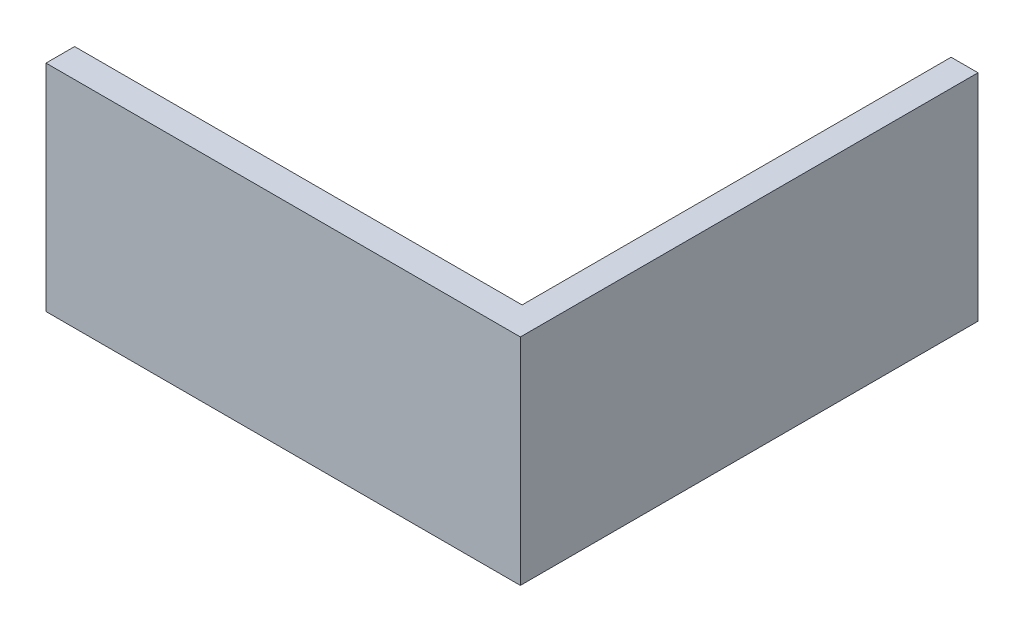
ISO-10303-21;
HEADER;
FILE_DESCRIPTION(('STEP AP214'),'2;1');
FILE_NAME('part.step','',(''),(''),'','','');
FILE_SCHEMA(('AUTOMOTIVE_DESIGN { 1 0 10303 214 1 1 1 1 }'));
ENDSEC;
DATA;
#1=APPLICATION_CONTEXT('core data for automotive mechanical design processes');
#2=APPLICATION_PROTOCOL_DEFINITION('international standard','automotive_design',2000,#1);
#3=PRODUCT_CONTEXT('',#1,'mechanical');
#4=PRODUCT('Part','Part','',(#3));
#5=PRODUCT_RELATED_PRODUCT_CATEGORY('part','',(#4));
#6=PRODUCT_DEFINITION_FORMATION('','',#4);
#7=PRODUCT_DEFINITION_CONTEXT('part definition',#1,'design');
#8=PRODUCT_DEFINITION('design','',#6,#7);
#9=PRODUCT_DEFINITION_SHAPE('','',#8);
#10=(LENGTH_UNIT() NAMED_UNIT(*) SI_UNIT(.MILLI.,.METRE.));
#11=(NAMED_UNIT(*) PLANE_ANGLE_UNIT() SI_UNIT($,.RADIAN.));
#12=(NAMED_UNIT(*) SI_UNIT($,.STERADIAN.) SOLID_ANGLE_UNIT());
#13=UNCERTAINTY_MEASURE_WITH_UNIT(LENGTH_MEASURE(1.E-05),#10,'distance_accuracy_value','');
#14=(GEOMETRIC_REPRESENTATION_CONTEXT(3) GLOBAL_UNCERTAINTY_ASSIGNED_CONTEXT((#13)) GLOBAL_UNIT_ASSIGNED_CONTEXT((#10,
#11,#12)) REPRESENTATION_CONTEXT('',''));
#15=CARTESIAN_POINT('',(0.,0.,0.));
#16=DIRECTION('',(0.,0.,1.));
#17=DIRECTION('',(1.,0.,0.));
#18=AXIS2_PLACEMENT_3D('',#15,#16,#17);
#19=CARTESIAN_POINT('',(-16.4694269363755,0.,-30.));
#20=DIRECTION('',(0.,0.,1.));
#21=DIRECTION('',(1.,0.,0.));
#22=AXIS2_PLACEMENT_3D('',#19,#20,#21);
#23=CYLINDRICAL_SURFACE('',#22,5.);
#24=CARTESIAN_POINT('',(-16.4694269363755,0.,-30.));
#25=DIRECTION('',(0.,0.,1.));
#26=DIRECTION('',(1.,0.,0.));
#27=AXIS2_PLACEMENT_3D('',#24,#25,#26);
#28=CIRCLE('',#27,5.);
#29=CARTESIAN_POINT('',(-11.4694269363755,0.,-30.));
#30=VERTEX_POINT('',#29);
#31=EDGE_CURVE('E11',#30,#30,#28,.T.);
#32=ORIENTED_EDGE('',*,*,#31,.T.);
#33=EDGE_LOOP('',(#32));
#34=FACE_BOUND('',#33,.T.);
#35=CARTESIAN_POINT('',(-16.4694269363755,0.,0.));
#36=DIRECTION('',(0.,0.,1.));
#37=DIRECTION('',(1.,0.,0.));
#38=AXIS2_PLACEMENT_3D('',#35,#36,#37);
#39=CIRCLE('',#38,5.);
#40=CARTESIAN_POINT('',(-11.4694269363755,0.,0.));
#41=VERTEX_POINT('',#40);
#42=EDGE_CURVE('E46',#41,#41,#39,.T.);
#43=ORIENTED_EDGE('',*,*,#42,.F.);
#44=EDGE_LOOP('',(#43));
#45=FACE_BOUND('',#44,.T.);
#46=ADVANCED_FACE('F43',(#34,#45),#23,.T.);
#47=CARTESIAN_POINT('',(-16.4694269363755,0.,-30.));
#48=DIRECTION('',(0.,0.,1.));
#49=DIRECTION('',(1.,0.,0.));
#50=AXIS2_PLACEMENT_3D('',#47,#48,#49);
#51=PLANE('',#50);
#52=ORIENTED_EDGE('',*,*,#31,.F.);
#53=EDGE_LOOP('',(#52));
#54=FACE_BOUND('',#53,.T.);
#55=ADVANCED_FACE('F58',(#54),#51,.F.);
#56=CARTESIAN_POINT('',(-16.4694269363755,0.,0.));
#57=DIRECTION('',(0.,0.,1.));
#58=DIRECTION('',(1.,0.,0.));
#59=AXIS2_PLACEMENT_3D('',#56,#57,#58);
#60=PLANE('',#59);
#61=ORIENTED_EDGE('',*,*,#42,.T.);
#62=EDGE_LOOP('',(#61));
#63=FACE_BOUND('',#62,.T.);
#64=ADVANCED_FACE('F55',(#63),#60,.T.);
#65=CLOSED_SHELL('',(#46,#55,#64));
#66=MANIFOLD_SOLID_BREP('B2',#65);
#67=CARTESIAN_POINT('',(82.9294362672978,37.621523407919,10.));
#68=DIRECTION('',(-1.,0.,0.));
#69=DIRECTION('',(0.,0.,1.));
#70=AXIS2_PLACEMENT_3D('',#67,#68,#69);
#71=PLANE('',#70);
#72=DIRECTION('',(0.,0.,-1.));
#73=VECTOR('',#72,1.);
#74=CARTESIAN_POINT('',(82.9294362672978,-37.621523407919,10.));
#75=LINE('',#74,#73);
#76=CARTESIAN_POINT('',(82.9294362672978,-37.621523407919,10.));
#77=VERTEX_POINT('',#76);
#78=CARTESIAN_POINT('',(82.9294362672978,-37.621523407919,-150.));
#79=VERTEX_POINT('',#78);
#80=EDGE_CURVE('E183',#77,#79,#75,.T.);
#81=ORIENTED_EDGE('',*,*,#80,.T.);
#82=DIRECTION('',(0.,1.,0.));
#83=VECTOR('',#82,1.);
#84=CARTESIAN_POINT('',(82.9294362672978,37.621523407919,-150.));
#85=LINE('',#84,#83);
#86=CARTESIAN_POINT('',(82.9294362672978,37.621523407919,-150.));
#87=VERTEX_POINT('',#86);
#88=EDGE_CURVE('E162',#79,#87,#85,.T.);
#89=ORIENTED_EDGE('',*,*,#88,.T.);
#90=DIRECTION('',(0.,0.,-1.));
#91=VECTOR('',#90,1.);
#92=CARTESIAN_POINT('',(82.9294362672978,37.621523407919,10.));
#93=LINE('',#92,#91);
#94=CARTESIAN_POINT('',(82.9294362672978,37.621523407919,10.));
#95=VERTEX_POINT('',#94);
#96=EDGE_CURVE('E41',#95,#87,#93,.T.);
#97=ORIENTED_EDGE('',*,*,#96,.F.);
#98=DIRECTION('',(0.,1.,0.));
#99=VECTOR('',#98,1.);
#100=CARTESIAN_POINT('',(82.9294362672978,37.621523407919,10.));
#101=LINE('',#100,#99);
#102=EDGE_CURVE('E177',#77,#95,#101,.T.);
#103=ORIENTED_EDGE('',*,*,#102,.F.);
#104=EDGE_LOOP('',(#81,#89,#97,#103));
#105=FACE_BOUND('',#104,.T.);
#106=ADVANCED_FACE('F84',(#105),#71,.F.);
#107=CARTESIAN_POINT('',(-82.9294362672978,37.621523407919,10.));
#108=DIRECTION('',(0.,-1.,0.));
#109=DIRECTION('',(0.,0.,-1.));
#110=AXIS2_PLACEMENT_3D('',#107,#108,#109);
#111=PLANE('',#110);
#112=ORIENTED_EDGE('',*,*,#96,.T.);
#113=DIRECTION('',(-1.,0.,0.));
#114=VECTOR('',#113,1.);
#115=CARTESIAN_POINT('',(73.5305730636245,37.621523407919,-150.));
#116=LINE('',#115,#114);
#117=CARTESIAN_POINT('',(73.5305730636245,37.621523407919,-150.));
#118=VERTEX_POINT('',#117);
#119=EDGE_CURVE('E152',#87,#118,#116,.T.);
#120=ORIENTED_EDGE('',*,*,#119,.T.);
#121=DIRECTION('',(0.,0.,1.));
#122=VECTOR('',#121,1.);
#123=CARTESIAN_POINT('',(73.5305730636245,37.621523407919,-150.));
#124=LINE('',#123,#122);
#125=CARTESIAN_POINT('',(73.5305730636245,37.621523407919,0.));
#126=VERTEX_POINT('',#125);
#127=EDGE_CURVE('E151',#118,#126,#124,.T.);
#128=ORIENTED_EDGE('',*,*,#127,.T.);
#129=DIRECTION('',(-1.,0.,0.));
#130=VECTOR('',#129,1.);
#131=CARTESIAN_POINT('',(-82.9294362672978,37.621523407919,0.));
#132=LINE('',#131,#130);
#133=CARTESIAN_POINT('',(-82.9294362672978,37.621523407919,0.));
#134=VERTEX_POINT('',#133);
#135=EDGE_CURVE('E175',#126,#134,#132,.T.);
#136=ORIENTED_EDGE('',*,*,#135,.T.);
#137=DIRECTION('',(0.,0.,-1.));
#138=VECTOR('',#137,1.);
#139=CARTESIAN_POINT('',(-82.9294362672978,37.621523407919,10.));
#140=LINE('',#139,#138);
#141=CARTESIAN_POINT('',(-82.9294362672978,37.621523407919,10.));
#142=VERTEX_POINT('',#141);
#143=EDGE_CURVE('E91',#142,#134,#140,.T.);
#144=ORIENTED_EDGE('',*,*,#143,.F.);
#145=DIRECTION('',(-1.,0.,0.));
#146=VECTOR('',#145,1.);
#147=CARTESIAN_POINT('',(-82.9294362672978,37.621523407919,10.));
#148=LINE('',#147,#146);
#149=EDGE_CURVE('E130',#95,#142,#148,.T.);
#150=ORIENTED_EDGE('',*,*,#149,.F.);
#151=EDGE_LOOP('',(#112,#120,#128,#136,#144,#150));
#152=FACE_BOUND('',#151,.T.);
#153=ADVANCED_FACE('F194',(#152),#111,.F.);
#154=CARTESIAN_POINT('',(-82.9294362672978,37.621523407919,10.));
#155=DIRECTION('',(1.,0.,0.));
#156=DIRECTION('',(0.,0.,-1.));
#157=AXIS2_PLACEMENT_3D('',#154,#155,#156);
#158=PLANE('',#157);
#159=DIRECTION('',(0.,-1.,0.));
#160=VECTOR('',#159,1.);
#161=CARTESIAN_POINT('',(-82.9294362672978,37.621523407919,0.));
#162=LINE('',#161,#160);
#163=CARTESIAN_POINT('',(-82.9294362672978,-37.621523407919,0.));
#164=VERTEX_POINT('',#163);
#165=EDGE_CURVE('E123',#134,#164,#162,.T.);
#166=ORIENTED_EDGE('',*,*,#165,.T.);
#167=DIRECTION('',(0.,0.,-1.));
#168=VECTOR('',#167,1.);
#169=CARTESIAN_POINT('',(-82.9294362672978,-37.621523407919,10.));
#170=LINE('',#169,#168);
#171=CARTESIAN_POINT('',(-82.9294362672978,-37.621523407919,10.));
#172=VERTEX_POINT('',#171);
#173=EDGE_CURVE('E188',#172,#164,#170,.T.);
#174=ORIENTED_EDGE('',*,*,#173,.F.);
#175=DIRECTION('',(0.,-1.,0.));
#176=VECTOR('',#175,1.);
#177=CARTESIAN_POINT('',(-82.9294362672978,37.621523407919,10.));
#178=LINE('',#177,#176);
#179=EDGE_CURVE('E180',#142,#172,#178,.T.);
#180=ORIENTED_EDGE('',*,*,#179,.F.);
#181=ORIENTED_EDGE('',*,*,#143,.T.);
#182=EDGE_LOOP('',(#166,#174,#180,#181));
#183=FACE_BOUND('',#182,.T.);
#184=ADVANCED_FACE('F190',(#183),#158,.F.);
#185=CARTESIAN_POINT('',(-82.9294362672978,-37.621523407919,10.));
#186=DIRECTION('',(0.,1.,0.));
#187=DIRECTION('',(0.,0.,1.));
#188=AXIS2_PLACEMENT_3D('',#185,#186,#187);
#189=PLANE('',#188);
#190=DIRECTION('',(1.,0.,0.));
#191=VECTOR('',#190,1.);
#192=CARTESIAN_POINT('',(-82.9294362672978,-37.621523407919,0.));
#193=LINE('',#192,#191);
#194=CARTESIAN_POINT('',(73.5305730636245,-37.621523407919,0.));
#195=VERTEX_POINT('',#194);
#196=EDGE_CURVE('E150',#164,#195,#193,.T.);
#197=ORIENTED_EDGE('',*,*,#196,.T.);
#198=DIRECTION('',(0.,0.,1.));
#199=VECTOR('',#198,1.);
#200=CARTESIAN_POINT('',(73.5305730636245,-37.621523407919,-150.));
#201=LINE('',#200,#199);
#202=CARTESIAN_POINT('',(73.5305730636245,-37.621523407919,-150.));
#203=VERTEX_POINT('',#202);
#204=EDGE_CURVE('E98',#203,#195,#201,.T.);
#205=ORIENTED_EDGE('',*,*,#204,.F.);
#206=DIRECTION('',(1.,0.,0.));
#207=VECTOR('',#206,1.);
#208=CARTESIAN_POINT('',(73.5305730636245,-37.621523407919,-150.));
#209=LINE('',#208,#207);
#210=EDGE_CURVE('E148',#203,#79,#209,.T.);
#211=ORIENTED_EDGE('',*,*,#210,.T.);
#212=ORIENTED_EDGE('',*,*,#80,.F.);
#213=DIRECTION('',(1.,0.,0.));
#214=VECTOR('',#213,1.);
#215=CARTESIAN_POINT('',(-82.9294362672978,-37.621523407919,10.));
#216=LINE('',#215,#214);
#217=EDGE_CURVE('E107',#172,#77,#216,.T.);
#218=ORIENTED_EDGE('',*,*,#217,.F.);
#219=ORIENTED_EDGE('',*,*,#173,.T.);
#220=EDGE_LOOP('',(#197,#205,#211,#212,#218,#219));
#221=FACE_BOUND('',#220,.T.);
#222=ADVANCED_FACE('F147',(#221),#189,.F.);
#223=CARTESIAN_POINT('',(0.,0.,10.));
#224=DIRECTION('',(0.,0.,1.));
#225=DIRECTION('',(1.,0.,0.));
#226=AXIS2_PLACEMENT_3D('',#223,#224,#225);
#227=PLANE('',#226);
#228=ORIENTED_EDGE('',*,*,#102,.T.);
#229=ORIENTED_EDGE('',*,*,#149,.T.);
#230=ORIENTED_EDGE('',*,*,#179,.T.);
#231=ORIENTED_EDGE('',*,*,#217,.T.);
#232=EDGE_LOOP('',(#228,#229,#230,#231));
#233=FACE_BOUND('',#232,.T.);
#234=ADVANCED_FACE('F198',(#233),#227,.T.);
#235=CARTESIAN_POINT('',(0.,0.,0.));
#236=DIRECTION('',(0.,0.,1.));
#237=DIRECTION('',(1.,0.,0.));
#238=AXIS2_PLACEMENT_3D('',#235,#236,#237);
#239=PLANE('',#238);
#240=ORIENTED_EDGE('',*,*,#135,.F.);
#241=DIRECTION('',(0.,-1.,0.));
#242=VECTOR('',#241,1.);
#243=CARTESIAN_POINT('',(73.5305730636245,37.621523407919,0.));
#244=LINE('',#243,#242);
#245=EDGE_CURVE('E165',#126,#195,#244,.T.);
#246=ORIENTED_EDGE('',*,*,#245,.T.);
#247=ORIENTED_EDGE('',*,*,#196,.F.);
#248=ORIENTED_EDGE('',*,*,#165,.F.);
#249=EDGE_LOOP('',(#240,#246,#247,#248));
#250=FACE_BOUND('',#249,.T.);
#251=ADVANCED_FACE('F193',(#250),#239,.F.);
#252=CARTESIAN_POINT('',(73.5305730636245,37.621523407919,-150.));
#253=DIRECTION('',(-1.,0.,0.));
#254=DIRECTION('',(0.,0.,1.));
#255=AXIS2_PLACEMENT_3D('',#252,#253,#254);
#256=PLANE('',#255);
#257=CARTESIAN_POINT('',(73.5305730636245,0.,-90.));
#258=DIRECTION('',(-1.,0.,0.));
#259=DIRECTION('',(0.,0.,1.));
#260=AXIS2_PLACEMENT_3D('',#257,#258,#259);
#261=CIRCLE('',#260,5.);
#262=CARTESIAN_POINT('',(73.5305730636245,0.,-85.));
#263=VERTEX_POINT('',#262);
#264=EDGE_CURVE('E170',#263,#263,#261,.T.);
#265=ORIENTED_EDGE('',*,*,#264,.F.);
#266=EDGE_LOOP('',(#265));
#267=FACE_BOUND('',#266,.T.);
#268=ORIENTED_EDGE('',*,*,#245,.F.);
#269=ORIENTED_EDGE('',*,*,#127,.F.);
#270=DIRECTION('',(0.,-1.,0.));
#271=VECTOR('',#270,1.);
#272=CARTESIAN_POINT('',(73.5305730636245,37.621523407919,-150.));
#273=LINE('',#272,#271);
#274=EDGE_CURVE('E159',#118,#203,#273,.T.);
#275=ORIENTED_EDGE('',*,*,#274,.T.);
#276=ORIENTED_EDGE('',*,*,#204,.T.);
#277=EDGE_LOOP('',(#268,#269,#275,#276));
#278=FACE_BOUND('',#277,.T.);
#279=ADVANCED_FACE('F164',(#267,#278),#256,.T.);
#280=CARTESIAN_POINT('',(0.,0.,-150.));
#281=DIRECTION('',(0.,0.,1.));
#282=DIRECTION('',(1.,0.,0.));
#283=AXIS2_PLACEMENT_3D('',#280,#281,#282);
#284=PLANE('',#283);
#285=ORIENTED_EDGE('',*,*,#274,.F.);
#286=ORIENTED_EDGE('',*,*,#119,.F.);
#287=ORIENTED_EDGE('',*,*,#88,.F.);
#288=ORIENTED_EDGE('',*,*,#210,.F.);
#289=EDGE_LOOP('',(#285,#286,#287,#288));
#290=FACE_BOUND('',#289,.T.);
#291=ADVANCED_FACE('F157',(#290),#284,.F.);
#292=CARTESIAN_POINT('',(43.5305730636245,0.,-90.));
#293=DIRECTION('',(1.,0.,0.));
#294=DIRECTION('',(0.,0.,-1.));
#295=AXIS2_PLACEMENT_3D('',#292,#293,#294);
#296=CYLINDRICAL_SURFACE('',#295,5.);
#297=CARTESIAN_POINT('',(43.5305730636245,0.,-90.));
#298=DIRECTION('',(-1.,0.,0.));
#299=DIRECTION('',(0.,0.,1.));
#300=AXIS2_PLACEMENT_3D('',#297,#298,#299);
#301=CIRCLE('',#300,5.);
#302=CARTESIAN_POINT('',(43.5305730636245,0.,-85.));
#303=VERTEX_POINT('',#302);
#304=EDGE_CURVE('E167',#303,#303,#301,.T.);
#305=ORIENTED_EDGE('',*,*,#304,.F.);
#306=EDGE_LOOP('',(#305));
#307=FACE_BOUND('',#306,.T.);
#308=ORIENTED_EDGE('',*,*,#264,.T.);
#309=EDGE_LOOP('',(#308));
#310=FACE_BOUND('',#309,.T.);
#311=ADVANCED_FACE('F244',(#307,#310),#296,.T.);
#312=CARTESIAN_POINT('',(43.5305730636245,0.,-90.));
#313=DIRECTION('',(-1.,0.,0.));
#314=DIRECTION('',(0.,0.,1.));
#315=AXIS2_PLACEMENT_3D('',#312,#313,#314);
#316=PLANE('',#315);
#317=ORIENTED_EDGE('',*,*,#304,.T.);
#318=EDGE_LOOP('',(#317));
#319=FACE_BOUND('',#318,.T.);
#320=ADVANCED_FACE('F259',(#319),#316,.T.);
#321=CLOSED_SHELL('',(#106,#153,#184,#222,#234,#251,#279,#291,#311,#320));
#322=MANIFOLD_SOLID_BREP('B6',#321);
#323=ADVANCED_BREP_SHAPE_REPRESENTATION('',(#18,#66,#322),#14);
#324=SHAPE_DEFINITION_REPRESENTATION(#9,#323);
ENDSEC;
END-ISO-10303-21;
